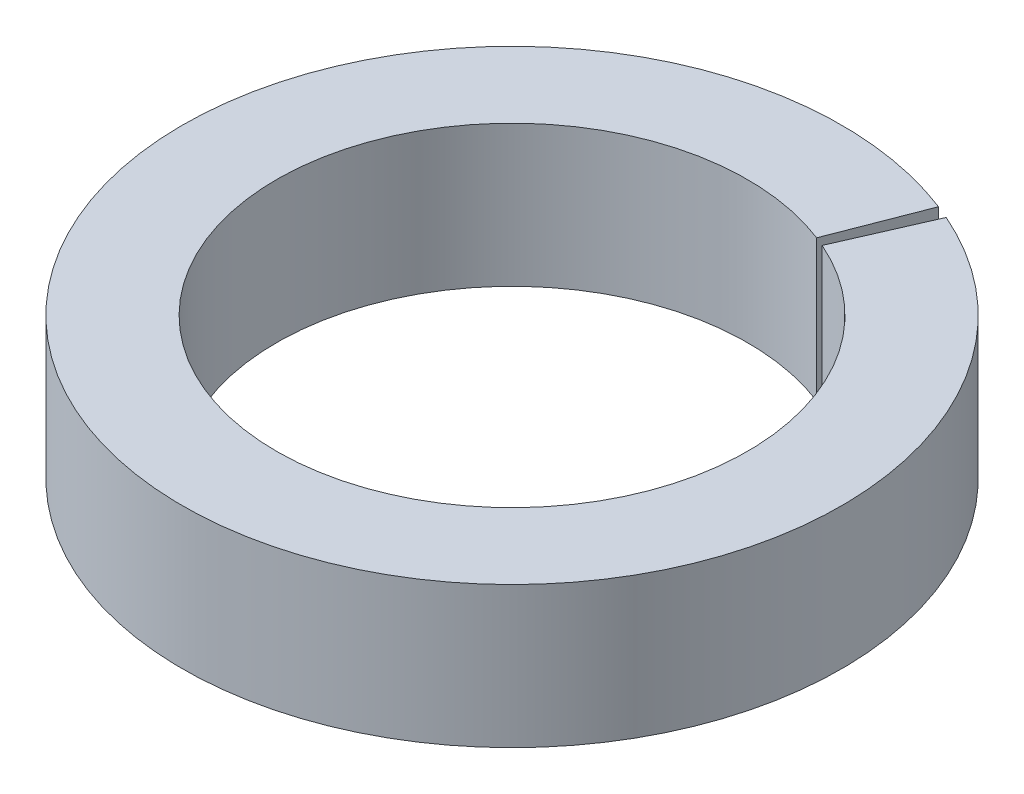
ISO-10303-21;
HEADER;
FILE_DESCRIPTION(('STEP AP214'),'2;1');
FILE_NAME('part.step','',(''),(''),'','','');
FILE_SCHEMA(('AUTOMOTIVE_DESIGN { 1 0 10303 214 1 1 1 1 }'));
ENDSEC;
DATA;
#1=APPLICATION_CONTEXT('core data for automotive mechanical design processes');
#2=APPLICATION_PROTOCOL_DEFINITION('international standard','automotive_design',2000,#1);
#3=PRODUCT_CONTEXT('',#1,'mechanical');
#4=PRODUCT('Part','Part','',(#3));
#5=PRODUCT_RELATED_PRODUCT_CATEGORY('part','',(#4));
#6=PRODUCT_DEFINITION_FORMATION('','',#4);
#7=PRODUCT_DEFINITION_CONTEXT('part definition',#1,'design');
#8=PRODUCT_DEFINITION('design','',#6,#7);
#9=PRODUCT_DEFINITION_SHAPE('','',#8);
#10=(LENGTH_UNIT() NAMED_UNIT(*) SI_UNIT(.MILLI.,.METRE.));
#11=(NAMED_UNIT(*) PLANE_ANGLE_UNIT() SI_UNIT($,.RADIAN.));
#12=(NAMED_UNIT(*) SI_UNIT($,.STERADIAN.) SOLID_ANGLE_UNIT());
#13=UNCERTAINTY_MEASURE_WITH_UNIT(LENGTH_MEASURE(1.E-05),#10,'distance_accuracy_value','');
#14=(GEOMETRIC_REPRESENTATION_CONTEXT(3) GLOBAL_UNCERTAINTY_ASSIGNED_CONTEXT((#13)) GLOBAL_UNIT_ASSIGNED_CONTEXT((#10,
#11,#12)) REPRESENTATION_CONTEXT('',''));
#15=CARTESIAN_POINT('',(0.,0.,0.));
#16=DIRECTION('',(0.,0.,1.));
#17=DIRECTION('',(1.,0.,0.));
#18=AXIS2_PLACEMENT_3D('',#15,#16,#17);
#19=CARTESIAN_POINT('',(0.,19.05,0.));
#20=DIRECTION('',(0.,-1.,0.));
#21=DIRECTION('',(0.,0.,-1.));
#22=AXIS2_PLACEMENT_3D('',#19,#20,#21);
#23=CYLINDRICAL_SURFACE('',#22,44.45);
#24=CARTESIAN_POINT('',(0.,0.,0.));
#25=DIRECTION('',(0.,1.,0.));
#26=DIRECTION('',(0.,0.,1.));
#27=AXIS2_PLACEMENT_3D('',#24,#25,#26);
#28=CIRCLE('',#27,44.45);
#29=CARTESIAN_POINT('',(16.0628766594954,0.,-41.4461879238832));
#30=VERTEX_POINT('',#29);
#31=CARTESIAN_POINT('',(17.8328971061376,0.,-40.7159708321183));
#32=VERTEX_POINT('',#31);
#33=EDGE_CURVE('E96',#30,#32,#28,.T.);
#34=ORIENTED_EDGE('',*,*,#33,.T.);
#35=DIRECTION('',(0.,-1.,0.));
#36=VECTOR('',#35,1.);
#37=CARTESIAN_POINT('',(17.8328971061376,19.05,-40.7159708321183));
#38=LINE('',#37,#36);
#39=CARTESIAN_POINT('',(17.8328971061376,19.05,-40.7159708321183));
#40=VERTEX_POINT('',#39);
#41=EDGE_CURVE('E11',#40,#32,#38,.T.);
#42=ORIENTED_EDGE('',*,*,#41,.F.);
#43=CARTESIAN_POINT('',(0.,19.05,0.));
#44=DIRECTION('',(0.,1.,0.));
#45=DIRECTION('',(0.,0.,1.));
#46=AXIS2_PLACEMENT_3D('',#43,#44,#45);
#47=CIRCLE('',#46,44.45);
#48=CARTESIAN_POINT('',(16.0628766594954,19.05,-41.4461879238832));
#49=VERTEX_POINT('',#48);
#50=EDGE_CURVE('E84',#49,#40,#47,.T.);
#51=ORIENTED_EDGE('',*,*,#50,.F.);
#52=DIRECTION('',(0.,-1.,0.));
#53=VECTOR('',#52,1.);
#54=CARTESIAN_POINT('',(16.0628766594954,19.05,-41.4461879238832));
#55=LINE('',#54,#53);
#56=EDGE_CURVE('E92',#49,#30,#55,.T.);
#57=ORIENTED_EDGE('',*,*,#56,.T.);
#58=EDGE_LOOP('',(#34,#42,#51,#57));
#59=FACE_BOUND('',#58,.T.);
#60=ADVANCED_FACE('F33',(#59),#23,.T.);
#61=CARTESIAN_POINT('',(17.8328971061376,19.05,-40.7159708321183));
#62=DIRECTION('',(0.915994844367116,0.,0.401190036133579));
#63=DIRECTION('',(0.401190036133579,0.,-0.915994844367116));
#64=AXIS2_PLACEMENT_3D('',#61,#62,#63);
#65=PLANE('',#64);
#66=DIRECTION('',(-0.401190036133579,0.,0.915994844367116));
#67=VECTOR('',#66,1.);
#68=CARTESIAN_POINT('',(17.8328971061376,0.,-40.7159708321183));
#69=LINE('',#68,#67);
#70=CARTESIAN_POINT('',(12.7377836472411,0.,-29.0828363086559));
#71=VERTEX_POINT('',#70);
#72=EDGE_CURVE('E88',#32,#71,#69,.T.);
#73=ORIENTED_EDGE('',*,*,#72,.T.);
#74=DIRECTION('',(0.,-1.,0.));
#75=VECTOR('',#74,1.);
#76=CARTESIAN_POINT('',(12.7377836472411,19.05,-29.0828363086559));
#77=LINE('',#76,#75);
#78=CARTESIAN_POINT('',(12.7377836472411,19.05,-29.0828363086559));
#79=VERTEX_POINT('',#78);
#80=EDGE_CURVE('E41',#79,#71,#77,.T.);
#81=ORIENTED_EDGE('',*,*,#80,.F.);
#82=DIRECTION('',(-0.401190036133579,0.,0.915994844367116));
#83=VECTOR('',#82,1.);
#84=CARTESIAN_POINT('',(17.8328971061376,19.05,-40.7159708321183));
#85=LINE('',#84,#83);
#86=EDGE_CURVE('E79',#40,#79,#85,.T.);
#87=ORIENTED_EDGE('',*,*,#86,.F.);
#88=ORIENTED_EDGE('',*,*,#41,.T.);
#89=EDGE_LOOP('',(#73,#81,#87,#88));
#90=FACE_BOUND('',#89,.T.);
#91=ADVANCED_FACE('F87',(#90),#65,.F.);
#92=CARTESIAN_POINT('',(0.,19.05,0.));
#93=DIRECTION('',(0.,-1.,0.));
#94=DIRECTION('',(0.,0.,-1.));
#95=AXIS2_PLACEMENT_3D('',#92,#93,#94);
#96=CYLINDRICAL_SURFACE('',#95,31.75);
#97=CARTESIAN_POINT('',(0.,0.,0.));
#98=DIRECTION('',(0.,-1.,0.));
#99=DIRECTION('',(0.,0.,1.));
#100=AXIS2_PLACEMENT_3D('',#97,#98,#99);
#101=CIRCLE('',#100,31.75);
#102=CARTESIAN_POINT('',(11.473483328211,0.,-29.6044199456308));
#103=VERTEX_POINT('',#102);
#104=EDGE_CURVE('E66',#71,#103,#101,.T.);
#105=ORIENTED_EDGE('',*,*,#104,.T.);
#106=DIRECTION('',(0.,-1.,0.));
#107=VECTOR('',#106,1.);
#108=CARTESIAN_POINT('',(11.473483328211,19.05,-29.6044199456308));
#109=LINE('',#108,#107);
#110=CARTESIAN_POINT('',(11.473483328211,19.05,-29.6044199456308));
#111=VERTEX_POINT('',#110);
#112=EDGE_CURVE('E89',#111,#103,#109,.T.);
#113=ORIENTED_EDGE('',*,*,#112,.F.);
#114=CARTESIAN_POINT('',(0.,19.05,0.));
#115=DIRECTION('',(0.,-1.,0.));
#116=DIRECTION('',(0.,0.,1.));
#117=AXIS2_PLACEMENT_3D('',#114,#115,#116);
#118=CIRCLE('',#117,31.75);
#119=EDGE_CURVE('E82',#79,#111,#118,.T.);
#120=ORIENTED_EDGE('',*,*,#119,.F.);
#121=ORIENTED_EDGE('',*,*,#80,.T.);
#122=EDGE_LOOP('',(#105,#113,#120,#121));
#123=FACE_BOUND('',#122,.T.);
#124=ADVANCED_FACE('F90',(#123),#96,.F.);
#125=CARTESIAN_POINT('',(16.0628766594954,19.05,-41.4461879238832));
#126=DIRECTION('',(-0.93242267545294,0.,-0.361369553644441));
#127=DIRECTION('',(-0.361369553644441,0.,0.93242267545294));
#128=AXIS2_PLACEMENT_3D('',#125,#126,#127);
#129=PLANE('',#128);
#130=DIRECTION('',(0.361369553644441,0.,-0.93242267545294));
#131=VECTOR('',#130,1.);
#132=CARTESIAN_POINT('',(16.0628766594954,0.,-41.4461879238832));
#133=LINE('',#132,#131);
#134=EDGE_CURVE('E72',#103,#30,#133,.T.);
#135=ORIENTED_EDGE('',*,*,#134,.T.);
#136=ORIENTED_EDGE('',*,*,#56,.F.);
#137=DIRECTION('',(0.361369553644441,0.,-0.93242267545294));
#138=VECTOR('',#137,1.);
#139=CARTESIAN_POINT('',(16.0628766594954,19.05,-41.4461879238832));
#140=LINE('',#139,#138);
#141=EDGE_CURVE('E49',#111,#49,#140,.T.);
#142=ORIENTED_EDGE('',*,*,#141,.F.);
#143=ORIENTED_EDGE('',*,*,#112,.T.);
#144=EDGE_LOOP('',(#135,#136,#142,#143));
#145=FACE_BOUND('',#144,.T.);
#146=ADVANCED_FACE('F103',(#145),#129,.F.);
#147=CARTESIAN_POINT('',(0.,19.05,0.));
#148=DIRECTION('',(0.,1.,0.));
#149=DIRECTION('',(0.,0.,1.));
#150=AXIS2_PLACEMENT_3D('',#147,#148,#149);
#151=PLANE('',#150);
#152=ORIENTED_EDGE('',*,*,#50,.T.);
#153=ORIENTED_EDGE('',*,*,#86,.T.);
#154=ORIENTED_EDGE('',*,*,#119,.T.);
#155=ORIENTED_EDGE('',*,*,#141,.T.);
#156=EDGE_LOOP('',(#152,#153,#154,#155));
#157=FACE_BOUND('',#156,.T.);
#158=ADVANCED_FACE('F80',(#157),#151,.T.);
#159=CARTESIAN_POINT('',(0.,0.,0.));
#160=DIRECTION('',(0.,1.,0.));
#161=DIRECTION('',(0.,0.,1.));
#162=AXIS2_PLACEMENT_3D('',#159,#160,#161);
#163=PLANE('',#162);
#164=ORIENTED_EDGE('',*,*,#33,.F.);
#165=ORIENTED_EDGE('',*,*,#134,.F.);
#166=ORIENTED_EDGE('',*,*,#104,.F.);
#167=ORIENTED_EDGE('',*,*,#72,.F.);
#168=EDGE_LOOP('',(#164,#165,#166,#167));
#169=FACE_BOUND('',#168,.T.);
#170=ADVANCED_FACE('F106',(#169),#163,.F.);
#171=CLOSED_SHELL('',(#60,#91,#124,#146,#158,#170));
#172=MANIFOLD_SOLID_BREP('B2',#171);
#173=ADVANCED_BREP_SHAPE_REPRESENTATION('',(#18,#172),#14);
#174=SHAPE_DEFINITION_REPRESENTATION(#9,#173);
ENDSEC;
END-ISO-10303-21;
